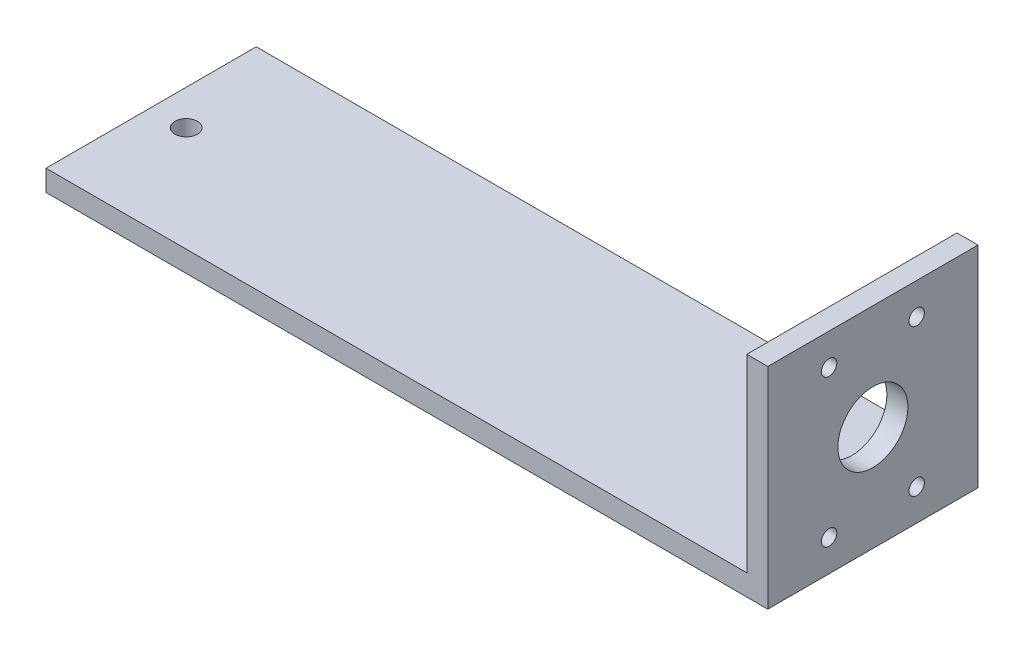
ISO-10303-21;
HEADER;
FILE_DESCRIPTION(('STEP AP214'),'2;1');
FILE_NAME('part.step','',(''),(''),'','','');
FILE_SCHEMA(('AUTOMOTIVE_DESIGN { 1 0 10303 214 1 1 1 1 }'));
ENDSEC;
DATA;
#1=APPLICATION_CONTEXT('core data for automotive mechanical design processes');
#2=APPLICATION_PROTOCOL_DEFINITION('international standard','automotive_design',2000,#1);
#3=PRODUCT_CONTEXT('',#1,'mechanical');
#4=PRODUCT('Part','Part','',(#3));
#5=PRODUCT_RELATED_PRODUCT_CATEGORY('part','',(#4));
#6=PRODUCT_DEFINITION_FORMATION('','',#4);
#7=PRODUCT_DEFINITION_CONTEXT('part definition',#1,'design');
#8=PRODUCT_DEFINITION('design','',#6,#7);
#9=PRODUCT_DEFINITION_SHAPE('','',#8);
#10=(LENGTH_UNIT() NAMED_UNIT(*) SI_UNIT(.MILLI.,.METRE.));
#11=(NAMED_UNIT(*) PLANE_ANGLE_UNIT() SI_UNIT($,.RADIAN.));
#12=(NAMED_UNIT(*) SI_UNIT($,.STERADIAN.) SOLID_ANGLE_UNIT());
#13=UNCERTAINTY_MEASURE_WITH_UNIT(LENGTH_MEASURE(1.E-05),#10,'distance_accuracy_value','');
#14=(GEOMETRIC_REPRESENTATION_CONTEXT(3) GLOBAL_UNCERTAINTY_ASSIGNED_CONTEXT((#13)) GLOBAL_UNIT_ASSIGNED_CONTEXT((#10,
#11,#12)) REPRESENTATION_CONTEXT('',''));
#15=CARTESIAN_POINT('',(0.,0.,0.));
#16=DIRECTION('',(0.,0.,1.));
#17=DIRECTION('',(1.,0.,0.));
#18=AXIS2_PLACEMENT_3D('',#15,#16,#17);
#19=CARTESIAN_POINT('',(50.,0.,0.));
#20=DIRECTION('',(-1.,0.,0.));
#21=DIRECTION('',(0.,0.,1.));
#22=AXIS2_PLACEMENT_3D('',#19,#20,#21);
#23=PLANE('',#22);
#24=CARTESIAN_POINT('',(50.,15.,0.));
#25=DIRECTION('',(-1.,0.,0.));
#26=DIRECTION('',(0.,0.,1.));
#27=AXIS2_PLACEMENT_3D('',#24,#25,#26);
#28=CIRCLE('',#27,5.);
#29=CARTESIAN_POINT('',(50.,15.,4.99999999999999));
#30=VERTEX_POINT('',#29);
#31=EDGE_CURVE('E255',#30,#30,#28,.T.);
#32=ORIENTED_EDGE('',*,*,#31,.F.);
#33=EDGE_LOOP('',(#32));
#34=FACE_BOUND('',#33,.T.);
#35=CARTESIAN_POINT('',(50.,4.5,6.25));
#36=DIRECTION('',(-1.,0.,0.));
#37=DIRECTION('',(0.,0.,1.));
#38=AXIS2_PLACEMENT_3D('',#35,#36,#37);
#39=CIRCLE('',#38,1.1);
#40=CARTESIAN_POINT('',(50.,4.5,7.34999999999999));
#41=VERTEX_POINT('',#40);
#42=EDGE_CURVE('E286',#41,#41,#39,.F.);
#43=ORIENTED_EDGE('',*,*,#42,.T.);
#44=EDGE_LOOP('',(#43));
#45=FACE_BOUND('',#44,.T.);
#46=CARTESIAN_POINT('',(50.,4.5,-6.25));
#47=DIRECTION('',(-1.,0.,0.));
#48=DIRECTION('',(0.,0.,1.));
#49=AXIS2_PLACEMENT_3D('',#46,#47,#48);
#50=CIRCLE('',#49,1.09999999999998);
#51=CARTESIAN_POINT('',(50.,4.5,-5.15000000000002));
#52=VERTEX_POINT('',#51);
#53=EDGE_CURVE('E283',#52,#52,#50,.T.);
#54=ORIENTED_EDGE('',*,*,#53,.F.);
#55=EDGE_LOOP('',(#54));
#56=FACE_BOUND('',#55,.T.);
#57=CARTESIAN_POINT('',(50.,25.5,6.25));
#58=DIRECTION('',(-1.,0.,0.));
#59=DIRECTION('',(0.,0.,1.));
#60=AXIS2_PLACEMENT_3D('',#57,#58,#59);
#61=CIRCLE('',#60,1.1);
#62=CARTESIAN_POINT('',(50.,25.5,7.35));
#63=VERTEX_POINT('',#62);
#64=EDGE_CURVE('E280',#63,#63,#61,.T.);
#65=ORIENTED_EDGE('',*,*,#64,.F.);
#66=EDGE_LOOP('',(#65));
#67=FACE_BOUND('',#66,.T.);
#68=DIRECTION('',(0.,0.,-1.));
#69=VECTOR('',#68,1.);
#70=CARTESIAN_POINT('',(50.,3.,-15.));
#71=LINE('',#70,#69);
#72=CARTESIAN_POINT('',(50.,3.,15.));
#73=VERTEX_POINT('',#72);
#74=CARTESIAN_POINT('',(50.,3.,-15.));
#75=VERTEX_POINT('',#74);
#76=EDGE_CURVE('E84',#73,#75,#71,.T.);
#77=ORIENTED_EDGE('',*,*,#76,.F.);
#78=DIRECTION('',(0.,-1.,0.));
#79=VECTOR('',#78,1.);
#80=CARTESIAN_POINT('',(50.,0.,15.));
#81=LINE('',#80,#79);
#82=CARTESIAN_POINT('',(50.,30.,15.));
#83=VERTEX_POINT('',#82);
#84=EDGE_CURVE('E103',#83,#73,#81,.T.);
#85=ORIENTED_EDGE('',*,*,#84,.F.);
#86=DIRECTION('',(0.,0.,1.));
#87=VECTOR('',#86,1.);
#88=CARTESIAN_POINT('',(50.,30.,15.));
#89=LINE('',#88,#87);
#90=CARTESIAN_POINT('',(50.,30.,-15.));
#91=VERTEX_POINT('',#90);
#92=EDGE_CURVE('E99',#91,#83,#89,.T.);
#93=ORIENTED_EDGE('',*,*,#92,.F.);
#94=DIRECTION('',(0.,1.,0.));
#95=VECTOR('',#94,1.);
#96=CARTESIAN_POINT('',(50.,0.,-15.));
#97=LINE('',#96,#95);
#98=EDGE_CURVE('E94',#75,#91,#97,.T.);
#99=ORIENTED_EDGE('',*,*,#98,.F.);
#100=EDGE_LOOP('',(#77,#85,#93,#99));
#101=FACE_BOUND('',#100,.T.);
#102=CARTESIAN_POINT('',(50.,25.5,-6.25));
#103=DIRECTION('',(-1.,0.,0.));
#104=DIRECTION('',(0.,0.,1.));
#105=AXIS2_PLACEMENT_3D('',#102,#103,#104);
#106=CIRCLE('',#105,1.09999999999998);
#107=CARTESIAN_POINT('',(50.,25.5,-5.15000000000002));
#108=VERTEX_POINT('',#107);
#109=EDGE_CURVE('E164',#108,#108,#106,.F.);
#110=ORIENTED_EDGE('',*,*,#109,.T.);
#111=EDGE_LOOP('',(#110));
#112=FACE_BOUND('',#111,.T.);
#113=ADVANCED_FACE('F45',(#34,#45,#56,#67,#101,#112),#23,.T.);
#114=CARTESIAN_POINT('',(53.,0.,0.));
#115=DIRECTION('',(-1.,0.,0.));
#116=DIRECTION('',(0.,0.,1.));
#117=AXIS2_PLACEMENT_3D('',#114,#115,#116);
#118=PLANE('',#117);
#119=CARTESIAN_POINT('',(53.,15.,0.));
#120=DIRECTION('',(1.,0.,0.));
#121=DIRECTION('',(0.,0.,-1.));
#122=AXIS2_PLACEMENT_3D('',#119,#120,#121);
#123=CIRCLE('',#122,5.);
#124=CARTESIAN_POINT('',(53.,15.,-5.00000000000001));
#125=VERTEX_POINT('',#124);
#126=EDGE_CURVE('E258',#125,#125,#123,.T.);
#127=ORIENTED_EDGE('',*,*,#126,.F.);
#128=EDGE_LOOP('',(#127));
#129=FACE_BOUND('',#128,.T.);
#130=CARTESIAN_POINT('',(53.,4.5,-6.25));
#131=DIRECTION('',(1.,0.,0.));
#132=DIRECTION('',(0.,0.,-1.));
#133=AXIS2_PLACEMENT_3D('',#130,#131,#132);
#134=CIRCLE('',#133,1.09999999999998);
#135=CARTESIAN_POINT('',(53.,4.5,-7.34999999999998));
#136=VERTEX_POINT('',#135);
#137=EDGE_CURVE('E262',#136,#136,#134,.T.);
#138=ORIENTED_EDGE('',*,*,#137,.F.);
#139=EDGE_LOOP('',(#138));
#140=FACE_BOUND('',#139,.T.);
#141=CARTESIAN_POINT('',(53.,25.5,6.25));
#142=DIRECTION('',(1.,0.,0.));
#143=DIRECTION('',(0.,0.,-1.));
#144=AXIS2_PLACEMENT_3D('',#141,#142,#143);
#145=CIRCLE('',#144,1.1);
#146=CARTESIAN_POINT('',(53.,25.5,5.15));
#147=VERTEX_POINT('',#146);
#148=EDGE_CURVE('E273',#147,#147,#145,.T.);
#149=ORIENTED_EDGE('',*,*,#148,.F.);
#150=EDGE_LOOP('',(#149));
#151=FACE_BOUND('',#150,.T.);
#152=DIRECTION('',(0.,-1.,0.));
#153=VECTOR('',#152,1.);
#154=CARTESIAN_POINT('',(53.,0.,15.));
#155=LINE('',#154,#153);
#156=CARTESIAN_POINT('',(53.,30.,15.));
#157=VERTEX_POINT('',#156);
#158=CARTESIAN_POINT('',(53.,0.,15.));
#159=VERTEX_POINT('',#158);
#160=EDGE_CURVE('E151',#157,#159,#155,.T.);
#161=ORIENTED_EDGE('',*,*,#160,.T.);
#162=DIRECTION('',(0.,0.,-1.));
#163=VECTOR('',#162,1.);
#164=CARTESIAN_POINT('',(53.,0.,15.));
#165=LINE('',#164,#163);
#166=CARTESIAN_POINT('',(53.,0.,-15.));
#167=VERTEX_POINT('',#166);
#168=EDGE_CURVE('E143',#159,#167,#165,.T.);
#169=ORIENTED_EDGE('',*,*,#168,.T.);
#170=DIRECTION('',(0.,1.,0.));
#171=VECTOR('',#170,1.);
#172=CARTESIAN_POINT('',(53.,0.,-15.));
#173=LINE('',#172,#171);
#174=CARTESIAN_POINT('',(53.,30.,-15.));
#175=VERTEX_POINT('',#174);
#176=EDGE_CURVE('E150',#167,#175,#173,.T.);
#177=ORIENTED_EDGE('',*,*,#176,.T.);
#178=DIRECTION('',(0.,0.,1.));
#179=VECTOR('',#178,1.);
#180=CARTESIAN_POINT('',(53.,30.,15.));
#181=LINE('',#180,#179);
#182=EDGE_CURVE('E156',#175,#157,#181,.T.);
#183=ORIENTED_EDGE('',*,*,#182,.T.);
#184=EDGE_LOOP('',(#161,#169,#177,#183));
#185=FACE_BOUND('',#184,.T.);
#186=CARTESIAN_POINT('',(53.,4.5,6.25));
#187=DIRECTION('',(-1.,0.,0.));
#188=DIRECTION('',(0.,0.,1.));
#189=AXIS2_PLACEMENT_3D('',#186,#187,#188);
#190=CIRCLE('',#189,1.1);
#191=CARTESIAN_POINT('',(53.,4.5,7.34999999999999));
#192=VERTEX_POINT('',#191);
#193=EDGE_CURVE('E268',#192,#192,#190,.T.);
#194=ORIENTED_EDGE('',*,*,#193,.T.);
#195=EDGE_LOOP('',(#194));
#196=FACE_BOUND('',#195,.T.);
#197=CARTESIAN_POINT('',(53.,25.5,-6.25));
#198=DIRECTION('',(-1.,0.,0.));
#199=DIRECTION('',(0.,0.,1.));
#200=AXIS2_PLACEMENT_3D('',#197,#198,#199);
#201=CIRCLE('',#200,1.09999999999998);
#202=CARTESIAN_POINT('',(53.,25.5,-5.15000000000002));
#203=VERTEX_POINT('',#202);
#204=EDGE_CURVE('E269',#203,#203,#201,.T.);
#205=ORIENTED_EDGE('',*,*,#204,.T.);
#206=EDGE_LOOP('',(#205));
#207=FACE_BOUND('',#206,.T.);
#208=ADVANCED_FACE('F153',(#129,#140,#151,#185,#196,#207),#118,.F.);
#209=CARTESIAN_POINT('',(-50.,3.,-15.));
#210=DIRECTION('',(0.,0.,1.));
#211=DIRECTION('',(1.,0.,0.));
#212=AXIS2_PLACEMENT_3D('',#209,#210,#211);
#213=PLANE('',#212);
#214=DIRECTION('',(-1.,0.,0.));
#215=VECTOR('',#214,1.);
#216=CARTESIAN_POINT('',(-50.,0.,-15.));
#217=LINE('',#216,#215);
#218=CARTESIAN_POINT('',(-50.,0.,-15.));
#219=VERTEX_POINT('',#218);
#220=EDGE_CURVE('E75',#167,#219,#217,.T.);
#221=ORIENTED_EDGE('',*,*,#220,.T.);
#222=DIRECTION('',(0.,-1.,0.));
#223=VECTOR('',#222,1.);
#224=CARTESIAN_POINT('',(-50.,3.,-15.));
#225=LINE('',#224,#223);
#226=CARTESIAN_POINT('',(-50.,3.,-15.));
#227=VERTEX_POINT('',#226);
#228=EDGE_CURVE('E11',#227,#219,#225,.T.);
#229=ORIENTED_EDGE('',*,*,#228,.F.);
#230=DIRECTION('',(-1.,0.,0.));
#231=VECTOR('',#230,1.);
#232=CARTESIAN_POINT('',(-50.,3.,-15.));
#233=LINE('',#232,#231);
#234=EDGE_CURVE('E105',#75,#227,#233,.T.);
#235=ORIENTED_EDGE('',*,*,#234,.F.);
#236=ORIENTED_EDGE('',*,*,#98,.T.);
#237=DIRECTION('',(-1.,0.,0.));
#238=VECTOR('',#237,1.);
#239=CARTESIAN_POINT('',(53.,30.,-15.));
#240=LINE('',#239,#238);
#241=EDGE_CURVE('E176',#175,#91,#240,.T.);
#242=ORIENTED_EDGE('',*,*,#241,.F.);
#243=ORIENTED_EDGE('',*,*,#176,.F.);
#244=EDGE_LOOP('',(#221,#229,#235,#236,#242,#243));
#245=FACE_BOUND('',#244,.T.);
#246=ADVANCED_FACE('F47',(#245),#213,.F.);
#247=CARTESIAN_POINT('',(-50.,3.,-15.));
#248=DIRECTION('',(1.,0.,0.));
#249=DIRECTION('',(0.,0.,-1.));
#250=AXIS2_PLACEMENT_3D('',#247,#248,#249);
#251=PLANE('',#250);
#252=DIRECTION('',(0.,0.,1.));
#253=VECTOR('',#252,1.);
#254=CARTESIAN_POINT('',(-50.,0.,-15.));
#255=LINE('',#254,#253);
#256=CARTESIAN_POINT('',(-50.,0.,15.));
#257=VERTEX_POINT('',#256);
#258=EDGE_CURVE('E116',#219,#257,#255,.T.);
#259=ORIENTED_EDGE('',*,*,#258,.T.);
#260=DIRECTION('',(0.,-1.,0.));
#261=VECTOR('',#260,1.);
#262=CARTESIAN_POINT('',(-50.,3.,15.));
#263=LINE('',#262,#261);
#264=CARTESIAN_POINT('',(-50.,3.,15.));
#265=VERTEX_POINT('',#264);
#266=EDGE_CURVE('E55',#265,#257,#263,.T.);
#267=ORIENTED_EDGE('',*,*,#266,.F.);
#268=DIRECTION('',(0.,0.,1.));
#269=VECTOR('',#268,1.);
#270=CARTESIAN_POINT('',(-50.,3.,-15.));
#271=LINE('',#270,#269);
#272=EDGE_CURVE('E63',#227,#265,#271,.T.);
#273=ORIENTED_EDGE('',*,*,#272,.F.);
#274=ORIENTED_EDGE('',*,*,#228,.T.);
#275=EDGE_LOOP('',(#259,#267,#273,#274));
#276=FACE_BOUND('',#275,.T.);
#277=ADVANCED_FACE('F364',(#276),#251,.F.);
#278=CARTESIAN_POINT('',(-50.,3.,15.));
#279=DIRECTION('',(0.,0.,-1.));
#280=DIRECTION('',(-1.,0.,0.));
#281=AXIS2_PLACEMENT_3D('',#278,#279,#280);
#282=PLANE('',#281);
#283=DIRECTION('',(1.,0.,0.));
#284=VECTOR('',#283,1.);
#285=CARTESIAN_POINT('',(-50.,0.,15.));
#286=LINE('',#285,#284);
#287=EDGE_CURVE('E112',#257,#159,#286,.T.);
#288=ORIENTED_EDGE('',*,*,#287,.T.);
#289=ORIENTED_EDGE('',*,*,#160,.F.);
#290=DIRECTION('',(-1.,0.,0.));
#291=VECTOR('',#290,1.);
#292=CARTESIAN_POINT('',(53.,30.,15.));
#293=LINE('',#292,#291);
#294=EDGE_CURVE('E171',#157,#83,#293,.T.);
#295=ORIENTED_EDGE('',*,*,#294,.T.);
#296=ORIENTED_EDGE('',*,*,#84,.T.);
#297=DIRECTION('',(1.,0.,0.));
#298=VECTOR('',#297,1.);
#299=CARTESIAN_POINT('',(-50.,3.,15.));
#300=LINE('',#299,#298);
#301=EDGE_CURVE('E110',#265,#73,#300,.T.);
#302=ORIENTED_EDGE('',*,*,#301,.F.);
#303=ORIENTED_EDGE('',*,*,#266,.T.);
#304=EDGE_LOOP('',(#288,#289,#295,#296,#302,#303));
#305=FACE_BOUND('',#304,.T.);
#306=ADVANCED_FACE('F134',(#305),#282,.F.);
#307=CARTESIAN_POINT('',(0.,3.,0.));
#308=DIRECTION('',(0.,1.,0.));
#309=DIRECTION('',(0.,0.,1.));
#310=AXIS2_PLACEMENT_3D('',#307,#308,#309);
#311=PLANE('',#310);
#312=CARTESIAN_POINT('',(45.,3.,0.));
#313=DIRECTION('',(0.,1.,0.));
#314=DIRECTION('',(0.,0.,1.));
#315=AXIS2_PLACEMENT_3D('',#312,#313,#314);
#316=CIRCLE('',#315,1.6);
#317=CARTESIAN_POINT('',(45.,3.,1.6));
#318=VERTEX_POINT('',#317);
#319=EDGE_CURVE('E182',#318,#318,#316,.T.);
#320=ORIENTED_EDGE('',*,*,#319,.F.);
#321=EDGE_LOOP('',(#320));
#322=FACE_BOUND('',#321,.T.);
#323=CARTESIAN_POINT('',(-45.,3.,0.));
#324=DIRECTION('',(0.,1.,0.));
#325=DIRECTION('',(0.,0.,-1.));
#326=AXIS2_PLACEMENT_3D('',#323,#324,#325);
#327=CIRCLE('',#326,1.6);
#328=CARTESIAN_POINT('',(-45.,3.,-1.6));
#329=VERTEX_POINT('',#328);
#330=EDGE_CURVE('E185',#329,#329,#327,.T.);
#331=ORIENTED_EDGE('',*,*,#330,.F.);
#332=EDGE_LOOP('',(#331));
#333=FACE_BOUND('',#332,.T.);
#334=ORIENTED_EDGE('',*,*,#76,.T.);
#335=ORIENTED_EDGE('',*,*,#234,.T.);
#336=ORIENTED_EDGE('',*,*,#272,.T.);
#337=ORIENTED_EDGE('',*,*,#301,.T.);
#338=EDGE_LOOP('',(#334,#335,#336,#337));
#339=FACE_BOUND('',#338,.T.);
#340=ADVANCED_FACE('F108',(#322,#333,#339),#311,.T.);
#341=CARTESIAN_POINT('',(0.,0.,0.));
#342=DIRECTION('',(0.,1.,0.));
#343=DIRECTION('',(0.,0.,1.));
#344=AXIS2_PLACEMENT_3D('',#341,#342,#343);
#345=PLANE('',#344);
#346=CARTESIAN_POINT('',(45.,0.,0.));
#347=DIRECTION('',(0.,1.,0.));
#348=DIRECTION('',(0.,0.,1.));
#349=AXIS2_PLACEMENT_3D('',#346,#347,#348);
#350=CIRCLE('',#349,1.6);
#351=CARTESIAN_POINT('',(45.,0.,1.6));
#352=VERTEX_POINT('',#351);
#353=EDGE_CURVE('E128',#352,#352,#350,.T.);
#354=ORIENTED_EDGE('',*,*,#353,.T.);
#355=EDGE_LOOP('',(#354));
#356=FACE_BOUND('',#355,.T.);
#357=CARTESIAN_POINT('',(-45.,0.,0.));
#358=DIRECTION('',(0.,1.,0.));
#359=DIRECTION('',(0.,0.,-1.));
#360=AXIS2_PLACEMENT_3D('',#357,#358,#359);
#361=CIRCLE('',#360,1.6);
#362=CARTESIAN_POINT('',(-45.,0.,-1.6));
#363=VERTEX_POINT('',#362);
#364=EDGE_CURVE('E119',#363,#363,#361,.T.);
#365=ORIENTED_EDGE('',*,*,#364,.T.);
#366=EDGE_LOOP('',(#365));
#367=FACE_BOUND('',#366,.T.);
#368=ORIENTED_EDGE('',*,*,#220,.F.);
#369=ORIENTED_EDGE('',*,*,#168,.F.);
#370=ORIENTED_EDGE('',*,*,#287,.F.);
#371=ORIENTED_EDGE('',*,*,#258,.F.);
#372=EDGE_LOOP('',(#368,#369,#370,#371));
#373=FACE_BOUND('',#372,.T.);
#374=ADVANCED_FACE('F141',(#356,#367,#373),#345,.F.);
#375=CARTESIAN_POINT('',(-45.,0.,0.));
#376=DIRECTION('',(0.,1.,0.));
#377=DIRECTION('',(0.,0.,1.));
#378=AXIS2_PLACEMENT_3D('',#375,#376,#377);
#379=CYLINDRICAL_SURFACE('',#378,1.6);
#380=ORIENTED_EDGE('',*,*,#364,.F.);
#381=EDGE_LOOP('',(#380));
#382=FACE_BOUND('',#381,.T.);
#383=ORIENTED_EDGE('',*,*,#330,.T.);
#384=EDGE_LOOP('',(#383));
#385=FACE_BOUND('',#384,.T.);
#386=ADVANCED_FACE('F195',(#382,#385),#379,.F.);
#387=CARTESIAN_POINT('',(45.,0.,0.));
#388=DIRECTION('',(0.,1.,0.));
#389=DIRECTION('',(0.,0.,1.));
#390=AXIS2_PLACEMENT_3D('',#387,#388,#389);
#391=CYLINDRICAL_SURFACE('',#390,1.6);
#392=ORIENTED_EDGE('',*,*,#353,.F.);
#393=EDGE_LOOP('',(#392));
#394=FACE_BOUND('',#393,.T.);
#395=ORIENTED_EDGE('',*,*,#319,.T.);
#396=EDGE_LOOP('',(#395));
#397=FACE_BOUND('',#396,.T.);
#398=ADVANCED_FACE('F197',(#394,#397),#391,.F.);
#399=CARTESIAN_POINT('',(53.,30.,15.));
#400=DIRECTION('',(0.,-1.,0.));
#401=DIRECTION('',(0.,0.,-1.));
#402=AXIS2_PLACEMENT_3D('',#399,#400,#401);
#403=PLANE('',#402);
#404=ORIENTED_EDGE('',*,*,#92,.T.);
#405=ORIENTED_EDGE('',*,*,#294,.F.);
#406=ORIENTED_EDGE('',*,*,#182,.F.);
#407=ORIENTED_EDGE('',*,*,#241,.T.);
#408=EDGE_LOOP('',(#404,#405,#406,#407));
#409=FACE_BOUND('',#408,.T.);
#410=ADVANCED_FACE('F203',(#409),#403,.F.);
#411=CARTESIAN_POINT('',(-50.,25.5,6.25000000000002));
#412=DIRECTION('',(1.,0.,0.));
#413=DIRECTION('',(0.,0.,-1.));
#414=AXIS2_PLACEMENT_3D('',#411,#412,#413);
#415=CYLINDRICAL_SURFACE('',#414,1.1);
#416=ORIENTED_EDGE('',*,*,#64,.T.);
#417=EDGE_LOOP('',(#416));
#418=FACE_BOUND('',#417,.T.);
#419=ORIENTED_EDGE('',*,*,#148,.T.);
#420=EDGE_LOOP('',(#419));
#421=FACE_BOUND('',#420,.T.);
#422=ADVANCED_FACE('F224',(#418,#421),#415,.F.);
#423=CARTESIAN_POINT('',(-50.,4.5,-6.24999999999998));
#424=DIRECTION('',(1.,0.,0.));
#425=DIRECTION('',(0.,0.,-1.));
#426=AXIS2_PLACEMENT_3D('',#423,#424,#425);
#427=CYLINDRICAL_SURFACE('',#426,1.09999999999998);
#428=ORIENTED_EDGE('',*,*,#53,.T.);
#429=EDGE_LOOP('',(#428));
#430=FACE_BOUND('',#429,.T.);
#431=ORIENTED_EDGE('',*,*,#137,.T.);
#432=EDGE_LOOP('',(#431));
#433=FACE_BOUND('',#432,.T.);
#434=ADVANCED_FACE('F229',(#430,#433),#427,.F.);
#435=CARTESIAN_POINT('',(-50.,4.5,6.25000000000002));
#436=DIRECTION('',(1.,0.,0.));
#437=DIRECTION('',(0.,0.,-1.));
#438=AXIS2_PLACEMENT_3D('',#435,#436,#437);
#439=CYLINDRICAL_SURFACE('',#438,1.1);
#440=ORIENTED_EDGE('',*,*,#42,.F.);
#441=EDGE_LOOP('',(#440));
#442=FACE_BOUND('',#441,.T.);
#443=ORIENTED_EDGE('',*,*,#193,.F.);
#444=EDGE_LOOP('',(#443));
#445=FACE_BOUND('',#444,.T.);
#446=ADVANCED_FACE('F236',(#442,#445),#439,.F.);
#447=CARTESIAN_POINT('',(-50.,25.5,-6.24999999999998));
#448=DIRECTION('',(1.,0.,0.));
#449=DIRECTION('',(0.,0.,-1.));
#450=AXIS2_PLACEMENT_3D('',#447,#448,#449);
#451=CYLINDRICAL_SURFACE('',#450,1.09999999999998);
#452=ORIENTED_EDGE('',*,*,#109,.F.);
#453=EDGE_LOOP('',(#452));
#454=FACE_BOUND('',#453,.T.);
#455=ORIENTED_EDGE('',*,*,#204,.F.);
#456=EDGE_LOOP('',(#455));
#457=FACE_BOUND('',#456,.T.);
#458=ADVANCED_FACE('F244',(#454,#457),#451,.F.);
#459=CARTESIAN_POINT('',(-50.,15.,0.));
#460=DIRECTION('',(1.,0.,0.));
#461=DIRECTION('',(0.,0.,-1.));
#462=AXIS2_PLACEMENT_3D('',#459,#460,#461);
#463=CYLINDRICAL_SURFACE('',#462,5.);
#464=ORIENTED_EDGE('',*,*,#31,.T.);
#465=EDGE_LOOP('',(#464));
#466=FACE_BOUND('',#465,.T.);
#467=ORIENTED_EDGE('',*,*,#126,.T.);
#468=EDGE_LOOP('',(#467));
#469=FACE_BOUND('',#468,.T.);
#470=ADVANCED_FACE('F246',(#466,#469),#463,.F.);
#471=CLOSED_SHELL('',(#113,#208,#246,#277,#306,#340,#374,#386,#398,#410,#422,#434,#446,#458,#470));
#472=MANIFOLD_SOLID_BREP('B2',#471);
#473=ADVANCED_BREP_SHAPE_REPRESENTATION('',(#18,#472),#14);
#474=SHAPE_DEFINITION_REPRESENTATION(#9,#473);
ENDSEC;
END-ISO-10303-21;
